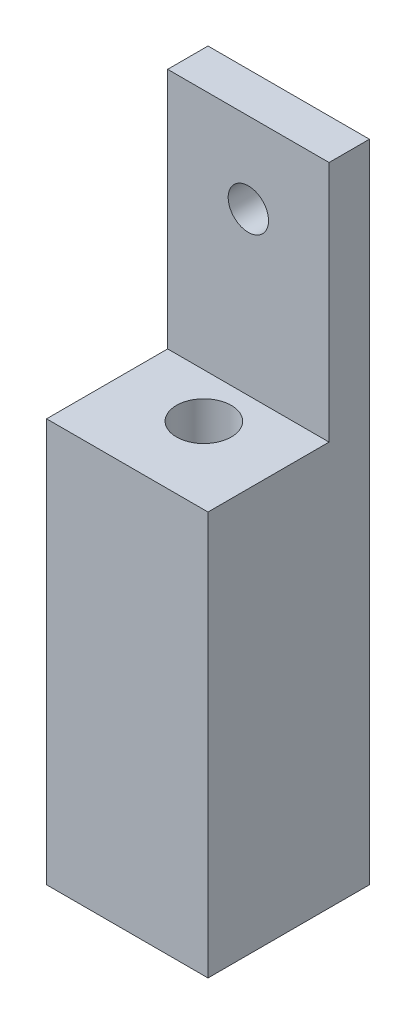
ISO-10303-21;
HEADER;
FILE_DESCRIPTION(('STEP AP214'),'2;1');
FILE_NAME('part.step','',(''),(''),'','','');
FILE_SCHEMA(('AUTOMOTIVE_DESIGN { 1 0 10303 214 1 1 1 1 }'));
ENDSEC;
DATA;
#1=APPLICATION_CONTEXT('core data for automotive mechanical design processes');
#2=APPLICATION_PROTOCOL_DEFINITION('international standard','automotive_design',2000,#1);
#3=PRODUCT_CONTEXT('',#1,'mechanical');
#4=PRODUCT('Part','Part','',(#3));
#5=PRODUCT_RELATED_PRODUCT_CATEGORY('part','',(#4));
#6=PRODUCT_DEFINITION_FORMATION('','',#4);
#7=PRODUCT_DEFINITION_CONTEXT('part definition',#1,'design');
#8=PRODUCT_DEFINITION('design','',#6,#7);
#9=PRODUCT_DEFINITION_SHAPE('','',#8);
#10=(LENGTH_UNIT() NAMED_UNIT(*) SI_UNIT(.MILLI.,.METRE.));
#11=(NAMED_UNIT(*) PLANE_ANGLE_UNIT() SI_UNIT($,.RADIAN.));
#12=(NAMED_UNIT(*) SI_UNIT($,.STERADIAN.) SOLID_ANGLE_UNIT());
#13=UNCERTAINTY_MEASURE_WITH_UNIT(LENGTH_MEASURE(1.E-05),#10,'distance_accuracy_value','');
#14=(GEOMETRIC_REPRESENTATION_CONTEXT(3) GLOBAL_UNCERTAINTY_ASSIGNED_CONTEXT((#13)) GLOBAL_UNIT_ASSIGNED_CONTEXT((#10,
#11,#12)) REPRESENTATION_CONTEXT('',''));
#15=CARTESIAN_POINT('',(0.,0.,0.));
#16=DIRECTION('',(0.,0.,1.));
#17=DIRECTION('',(1.,0.,0.));
#18=AXIS2_PLACEMENT_3D('',#15,#16,#17);
#19=CARTESIAN_POINT('',(0.,25.,0.));
#20=DIRECTION('',(0.,-1.,0.));
#21=DIRECTION('',(0.,0.,-1.));
#22=AXIS2_PLACEMENT_3D('',#19,#20,#21);
#23=PLANE('',#22);
#24=CARTESIAN_POINT('',(0.,25.,0.51));
#25=DIRECTION('',(0.,1.,0.));
#26=DIRECTION('',(0.,0.,1.));
#27=AXIS2_PLACEMENT_3D('',#24,#25,#26);
#28=CIRCLE('',#27,3.4);
#29=CARTESIAN_POINT('',(0.,25.,3.91));
#30=VERTEX_POINT('',#29);
#31=EDGE_CURVE('E105',#30,#30,#28,.T.);
#32=ORIENTED_EDGE('',*,*,#31,.F.);
#33=EDGE_LOOP('',(#32));
#34=FACE_BOUND('',#33,.T.);
#35=DIRECTION('',(1.,0.,0.));
#36=VECTOR('',#35,1.);
#37=CARTESIAN_POINT('',(-10.,25.,-5.));
#38=LINE('',#37,#36);
#39=CARTESIAN_POINT('',(-10.,25.,-5.));
#40=VERTEX_POINT('',#39);
#41=CARTESIAN_POINT('',(10.,25.,-5.));
#42=VERTEX_POINT('',#41);
#43=EDGE_CURVE('E55',#40,#42,#38,.T.);
#44=ORIENTED_EDGE('',*,*,#43,.F.);
#45=DIRECTION('',(0.,0.,1.));
#46=VECTOR('',#45,1.);
#47=CARTESIAN_POINT('',(-10.,25.,10.));
#48=LINE('',#47,#46);
#49=CARTESIAN_POINT('',(-10.,25.,10.));
#50=VERTEX_POINT('',#49);
#51=EDGE_CURVE('E163',#40,#50,#48,.T.);
#52=ORIENTED_EDGE('',*,*,#51,.T.);
#53=DIRECTION('',(1.,0.,0.));
#54=VECTOR('',#53,1.);
#55=CARTESIAN_POINT('',(-10.,25.,10.));
#56=LINE('',#55,#54);
#57=CARTESIAN_POINT('',(10.,25.,10.));
#58=VERTEX_POINT('',#57);
#59=EDGE_CURVE('E61',#50,#58,#56,.T.);
#60=ORIENTED_EDGE('',*,*,#59,.T.);
#61=DIRECTION('',(0.,0.,-1.));
#62=VECTOR('',#61,1.);
#63=CARTESIAN_POINT('',(10.,25.,10.));
#64=LINE('',#63,#62);
#65=EDGE_CURVE('E91',#58,#42,#64,.T.);
#66=ORIENTED_EDGE('',*,*,#65,.T.);
#67=EDGE_LOOP('',(#44,#52,#60,#66));
#68=FACE_BOUND('',#67,.T.);
#69=ADVANCED_FACE('F39',(#34,#68),#23,.F.);
#70=CARTESIAN_POINT('',(0.,-25.,0.));
#71=DIRECTION('',(0.,-1.,0.));
#72=DIRECTION('',(0.,0.,-1.));
#73=AXIS2_PLACEMENT_3D('',#70,#71,#72);
#74=PLANE('',#73);
#75=DIRECTION('',(0.,0.,-1.));
#76=VECTOR('',#75,1.);
#77=CARTESIAN_POINT('',(10.,-25.,10.));
#78=LINE('',#77,#76);
#79=CARTESIAN_POINT('',(10.,-25.,10.));
#80=VERTEX_POINT('',#79);
#81=CARTESIAN_POINT('',(10.,-25.,-10.));
#82=VERTEX_POINT('',#81);
#83=EDGE_CURVE('E97',#80,#82,#78,.T.);
#84=ORIENTED_EDGE('',*,*,#83,.F.);
#85=DIRECTION('',(1.,0.,0.));
#86=VECTOR('',#85,1.);
#87=CARTESIAN_POINT('',(-10.,-25.,10.));
#88=LINE('',#87,#86);
#89=CARTESIAN_POINT('',(-10.,-25.,10.));
#90=VERTEX_POINT('',#89);
#91=EDGE_CURVE('E80',#90,#80,#88,.T.);
#92=ORIENTED_EDGE('',*,*,#91,.F.);
#93=DIRECTION('',(0.,0.,1.));
#94=VECTOR('',#93,1.);
#95=CARTESIAN_POINT('',(-10.,-25.,10.));
#96=LINE('',#95,#94);
#97=CARTESIAN_POINT('',(-10.,-25.,-10.));
#98=VERTEX_POINT('',#97);
#99=EDGE_CURVE('E92',#98,#90,#96,.T.);
#100=ORIENTED_EDGE('',*,*,#99,.F.);
#101=DIRECTION('',(-1.,0.,0.));
#102=VECTOR('',#101,1.);
#103=CARTESIAN_POINT('',(-10.,-25.,-10.));
#104=LINE('',#103,#102);
#105=EDGE_CURVE('E103',#82,#98,#104,.T.);
#106=ORIENTED_EDGE('',*,*,#105,.F.);
#107=EDGE_LOOP('',(#84,#92,#100,#106));
#108=FACE_BOUND('',#107,.T.);
#109=CARTESIAN_POINT('',(0.,-25.,0.51));
#110=DIRECTION('',(0.,1.,0.));
#111=DIRECTION('',(0.,0.,1.));
#112=AXIS2_PLACEMENT_3D('',#109,#110,#111);
#113=CIRCLE('',#112,3.4);
#114=CARTESIAN_POINT('',(0.,-25.,3.91));
#115=VERTEX_POINT('',#114);
#116=EDGE_CURVE('E111',#115,#115,#113,.T.);
#117=ORIENTED_EDGE('',*,*,#116,.T.);
#118=EDGE_LOOP('',(#117));
#119=FACE_BOUND('',#118,.T.);
#120=ADVANCED_FACE('F101',(#108,#119),#74,.T.);
#121=CARTESIAN_POINT('',(10.,25.,10.));
#122=DIRECTION('',(-1.,0.,0.));
#123=DIRECTION('',(0.,0.,1.));
#124=AXIS2_PLACEMENT_3D('',#121,#122,#123);
#125=PLANE('',#124);
#126=ORIENTED_EDGE('',*,*,#83,.T.);
#127=DIRECTION('',(0.,-1.,0.));
#128=VECTOR('',#127,1.);
#129=CARTESIAN_POINT('',(10.,25.,-10.));
#130=LINE('',#129,#128);
#131=CARTESIAN_POINT('',(10.,55.,-10.));
#132=VERTEX_POINT('',#131);
#133=EDGE_CURVE('E11',#132,#82,#130,.T.);
#134=ORIENTED_EDGE('',*,*,#133,.F.);
#135=DIRECTION('',(0.,0.,-1.));
#136=VECTOR('',#135,1.);
#137=CARTESIAN_POINT('',(10.,55.,-10.));
#138=LINE('',#137,#136);
#139=CARTESIAN_POINT('',(10.,55.,-5.));
#140=VERTEX_POINT('',#139);
#141=EDGE_CURVE('E141',#140,#132,#138,.T.);
#142=ORIENTED_EDGE('',*,*,#141,.F.);
#143=DIRECTION('',(0.,-1.,0.));
#144=VECTOR('',#143,1.);
#145=CARTESIAN_POINT('',(10.,55.,-5.));
#146=LINE('',#145,#144);
#147=EDGE_CURVE('E143',#140,#42,#146,.T.);
#148=ORIENTED_EDGE('',*,*,#147,.T.);
#149=ORIENTED_EDGE('',*,*,#65,.F.);
#150=DIRECTION('',(0.,-1.,0.));
#151=VECTOR('',#150,1.);
#152=CARTESIAN_POINT('',(10.,25.,10.));
#153=LINE('',#152,#151);
#154=EDGE_CURVE('E83',#58,#80,#153,.T.);
#155=ORIENTED_EDGE('',*,*,#154,.T.);
#156=EDGE_LOOP('',(#126,#134,#142,#148,#149,#155));
#157=FACE_BOUND('',#156,.T.);
#158=ADVANCED_FACE('F41',(#157),#125,.F.);
#159=CARTESIAN_POINT('',(-10.,25.,-10.));
#160=DIRECTION('',(0.,0.,1.));
#161=DIRECTION('',(1.,0.,0.));
#162=AXIS2_PLACEMENT_3D('',#159,#160,#161);
#163=PLANE('',#162);
#164=CARTESIAN_POINT('',(0.,45.,-10.));
#165=DIRECTION('',(0.,0.,1.));
#166=DIRECTION('',(1.,0.,0.));
#167=AXIS2_PLACEMENT_3D('',#164,#165,#166);
#168=CIRCLE('',#167,2.5);
#169=CARTESIAN_POINT('',(2.5,45.,-10.));
#170=VERTEX_POINT('',#169);
#171=EDGE_CURVE('E154',#170,#170,#168,.T.);
#172=ORIENTED_EDGE('',*,*,#171,.T.);
#173=EDGE_LOOP('',(#172));
#174=FACE_BOUND('',#173,.T.);
#175=ORIENTED_EDGE('',*,*,#105,.T.);
#176=DIRECTION('',(0.,-1.,0.));
#177=VECTOR('',#176,1.);
#178=CARTESIAN_POINT('',(-10.,25.,-10.));
#179=LINE('',#178,#177);
#180=CARTESIAN_POINT('',(-10.,55.,-10.));
#181=VERTEX_POINT('',#180);
#182=EDGE_CURVE('E48',#181,#98,#179,.T.);
#183=ORIENTED_EDGE('',*,*,#182,.F.);
#184=DIRECTION('',(-1.,0.,0.));
#185=VECTOR('',#184,1.);
#186=CARTESIAN_POINT('',(-10.,55.,-10.));
#187=LINE('',#186,#185);
#188=EDGE_CURVE('E133',#132,#181,#187,.T.);
#189=ORIENTED_EDGE('',*,*,#188,.F.);
#190=ORIENTED_EDGE('',*,*,#133,.T.);
#191=EDGE_LOOP('',(#175,#183,#189,#190));
#192=FACE_BOUND('',#191,.T.);
#193=ADVANCED_FACE('F131',(#174,#192),#163,.F.);
#194=CARTESIAN_POINT('',(-10.,25.,10.));
#195=DIRECTION('',(1.,0.,0.));
#196=DIRECTION('',(0.,0.,-1.));
#197=AXIS2_PLACEMENT_3D('',#194,#195,#196);
#198=PLANE('',#197);
#199=ORIENTED_EDGE('',*,*,#99,.T.);
#200=DIRECTION('',(0.,-1.,0.));
#201=VECTOR('',#200,1.);
#202=CARTESIAN_POINT('',(-10.,25.,10.));
#203=LINE('',#202,#201);
#204=EDGE_CURVE('E86',#50,#90,#203,.T.);
#205=ORIENTED_EDGE('',*,*,#204,.F.);
#206=ORIENTED_EDGE('',*,*,#51,.F.);
#207=DIRECTION('',(0.,-1.,0.));
#208=VECTOR('',#207,1.);
#209=CARTESIAN_POINT('',(-10.,55.,-5.));
#210=LINE('',#209,#208);
#211=CARTESIAN_POINT('',(-10.,55.,-5.));
#212=VERTEX_POINT('',#211);
#213=EDGE_CURVE('E147',#212,#40,#210,.T.);
#214=ORIENTED_EDGE('',*,*,#213,.F.);
#215=DIRECTION('',(0.,0.,1.));
#216=VECTOR('',#215,1.);
#217=CARTESIAN_POINT('',(-10.,55.,-10.));
#218=LINE('',#217,#216);
#219=EDGE_CURVE('E127',#181,#212,#218,.T.);
#220=ORIENTED_EDGE('',*,*,#219,.F.);
#221=ORIENTED_EDGE('',*,*,#182,.T.);
#222=EDGE_LOOP('',(#199,#205,#206,#214,#220,#221));
#223=FACE_BOUND('',#222,.T.);
#224=ADVANCED_FACE('F124',(#223),#198,.F.);
#225=CARTESIAN_POINT('',(-10.,25.,10.));
#226=DIRECTION('',(0.,0.,-1.));
#227=DIRECTION('',(-1.,0.,0.));
#228=AXIS2_PLACEMENT_3D('',#225,#226,#227);
#229=PLANE('',#228);
#230=ORIENTED_EDGE('',*,*,#91,.T.);
#231=ORIENTED_EDGE('',*,*,#154,.F.);
#232=ORIENTED_EDGE('',*,*,#59,.F.);
#233=ORIENTED_EDGE('',*,*,#204,.T.);
#234=EDGE_LOOP('',(#230,#231,#232,#233));
#235=FACE_BOUND('',#234,.T.);
#236=ADVANCED_FACE('F82',(#235),#229,.F.);
#237=CARTESIAN_POINT('',(0.,25.,0.51));
#238=DIRECTION('',(0.,-1.,0.));
#239=DIRECTION('',(0.,0.,-1.));
#240=AXIS2_PLACEMENT_3D('',#237,#238,#239);
#241=CYLINDRICAL_SURFACE('',#240,3.4);
#242=ORIENTED_EDGE('',*,*,#31,.T.);
#243=EDGE_LOOP('',(#242));
#244=FACE_BOUND('',#243,.T.);
#245=ORIENTED_EDGE('',*,*,#116,.F.);
#246=EDGE_LOOP('',(#245));
#247=FACE_BOUND('',#246,.T.);
#248=ADVANCED_FACE('F193',(#244,#247),#241,.F.);
#249=CARTESIAN_POINT('',(-10.,55.,-5.));
#250=DIRECTION('',(0.,0.,-1.));
#251=DIRECTION('',(-1.,0.,0.));
#252=AXIS2_PLACEMENT_3D('',#249,#250,#251);
#253=PLANE('',#252);
#254=CARTESIAN_POINT('',(0.,45.,-5.));
#255=DIRECTION('',(0.,0.,1.));
#256=DIRECTION('',(1.,0.,0.));
#257=AXIS2_PLACEMENT_3D('',#254,#255,#256);
#258=CIRCLE('',#257,2.5);
#259=CARTESIAN_POINT('',(2.5,45.,-5.));
#260=VERTEX_POINT('',#259);
#261=EDGE_CURVE('E177',#260,#260,#258,.T.);
#262=ORIENTED_EDGE('',*,*,#261,.F.);
#263=EDGE_LOOP('',(#262));
#264=FACE_BOUND('',#263,.T.);
#265=ORIENTED_EDGE('',*,*,#43,.T.);
#266=ORIENTED_EDGE('',*,*,#147,.F.);
#267=DIRECTION('',(1.,0.,0.));
#268=VECTOR('',#267,1.);
#269=CARTESIAN_POINT('',(-10.,55.,-5.));
#270=LINE('',#269,#268);
#271=EDGE_CURVE('E149',#212,#140,#270,.T.);
#272=ORIENTED_EDGE('',*,*,#271,.F.);
#273=ORIENTED_EDGE('',*,*,#213,.T.);
#274=EDGE_LOOP('',(#265,#266,#272,#273));
#275=FACE_BOUND('',#274,.T.);
#276=ADVANCED_FACE('F168',(#264,#275),#253,.F.);
#277=CARTESIAN_POINT('',(0.,55.,0.));
#278=DIRECTION('',(0.,1.,0.));
#279=DIRECTION('',(0.,0.,1.));
#280=AXIS2_PLACEMENT_3D('',#277,#278,#279);
#281=PLANE('',#280);
#282=ORIENTED_EDGE('',*,*,#219,.T.);
#283=ORIENTED_EDGE('',*,*,#271,.T.);
#284=ORIENTED_EDGE('',*,*,#141,.T.);
#285=ORIENTED_EDGE('',*,*,#188,.T.);
#286=EDGE_LOOP('',(#282,#283,#284,#285));
#287=FACE_BOUND('',#286,.T.);
#288=ADVANCED_FACE('F137',(#287),#281,.T.);
#289=CARTESIAN_POINT('',(0.,45.,-10.));
#290=DIRECTION('',(0.,0.,1.));
#291=DIRECTION('',(1.,0.,0.));
#292=AXIS2_PLACEMENT_3D('',#289,#290,#291);
#293=CYLINDRICAL_SURFACE('',#292,2.5);
#294=ORIENTED_EDGE('',*,*,#171,.F.);
#295=EDGE_LOOP('',(#294));
#296=FACE_BOUND('',#295,.T.);
#297=ORIENTED_EDGE('',*,*,#261,.T.);
#298=EDGE_LOOP('',(#297));
#299=FACE_BOUND('',#298,.T.);
#300=ADVANCED_FACE('F186',(#296,#299),#293,.F.);
#301=CLOSED_SHELL('',(#69,#120,#158,#193,#224,#236,#248,#276,#288,#300));
#302=MANIFOLD_SOLID_BREP('B2',#301);
#303=ADVANCED_BREP_SHAPE_REPRESENTATION('',(#18,#302),#14);
#304=SHAPE_DEFINITION_REPRESENTATION(#9,#303);
ENDSEC;
END-ISO-10303-21;
